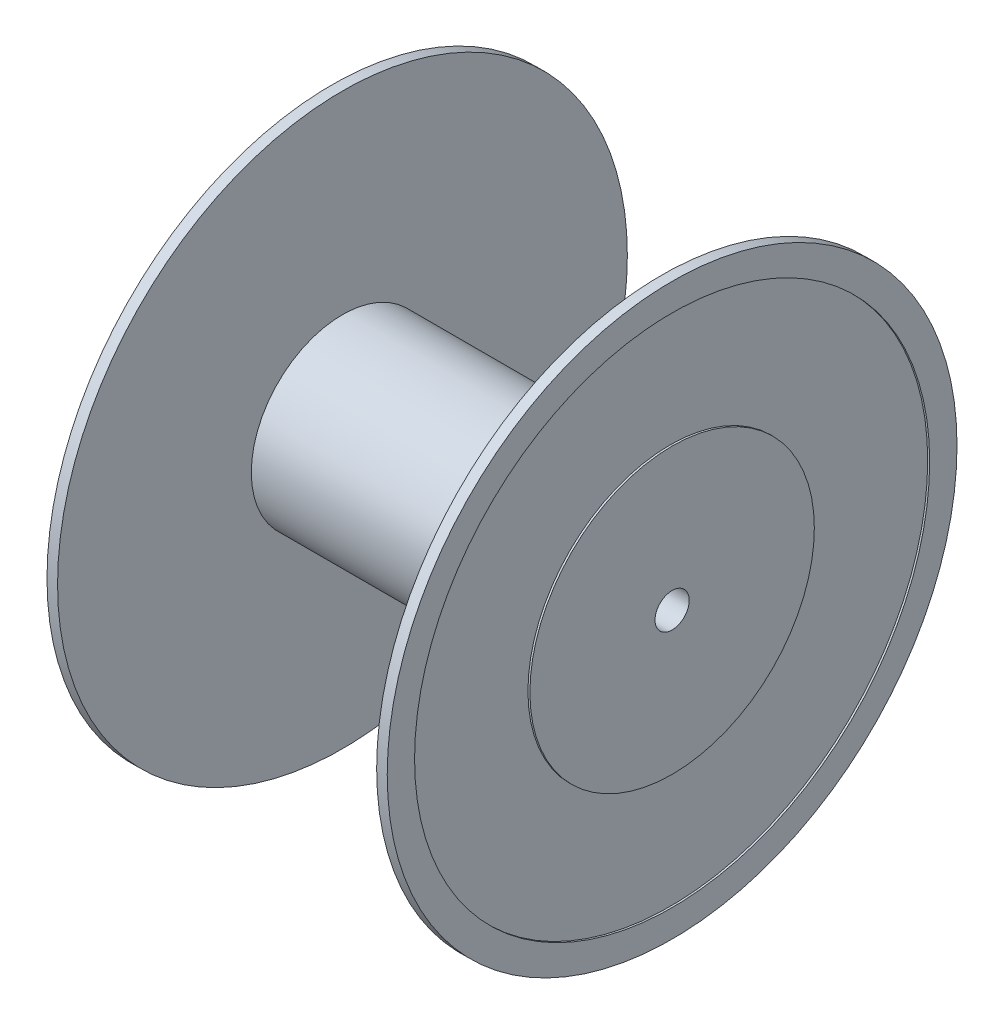
ISO-10303-21;
HEADER;
FILE_DESCRIPTION(('STEP AP214'),'2;1');
FILE_NAME('part.step','',(''),(''),'','','');
FILE_SCHEMA(('AUTOMOTIVE_DESIGN { 1 0 10303 214 1 1 1 1 }'));
ENDSEC;
DATA;
#1=APPLICATION_CONTEXT('core data for automotive mechanical design processes');
#2=APPLICATION_PROTOCOL_DEFINITION('international standard','automotive_design',2000,#1);
#3=PRODUCT_CONTEXT('',#1,'mechanical');
#4=PRODUCT('Part','Part','',(#3));
#5=PRODUCT_RELATED_PRODUCT_CATEGORY('part','',(#4));
#6=PRODUCT_DEFINITION_FORMATION('','',#4);
#7=PRODUCT_DEFINITION_CONTEXT('part definition',#1,'design');
#8=PRODUCT_DEFINITION('design','',#6,#7);
#9=PRODUCT_DEFINITION_SHAPE('','',#8);
#10=(LENGTH_UNIT() NAMED_UNIT(*) SI_UNIT(.MILLI.,.METRE.));
#11=(NAMED_UNIT(*) PLANE_ANGLE_UNIT() SI_UNIT($,.RADIAN.));
#12=(NAMED_UNIT(*) SI_UNIT($,.STERADIAN.) SOLID_ANGLE_UNIT());
#13=UNCERTAINTY_MEASURE_WITH_UNIT(LENGTH_MEASURE(1.E-05),#10,'distance_accuracy_value','');
#14=(GEOMETRIC_REPRESENTATION_CONTEXT(3) GLOBAL_UNCERTAINTY_ASSIGNED_CONTEXT((#13)) GLOBAL_UNIT_ASSIGNED_CONTEXT((#10,
#11,#12)) REPRESENTATION_CONTEXT('',''));
#15=CARTESIAN_POINT('',(0.,0.,0.));
#16=DIRECTION('',(0.,0.,1.));
#17=DIRECTION('',(1.,0.,0.));
#18=AXIS2_PLACEMENT_3D('',#15,#16,#17);
#19=CARTESIAN_POINT('',(-47.3964,0.,0.));
#20=DIRECTION('',(-1.,0.,0.));
#21=DIRECTION('',(0.,0.,-1.));
#22=AXIS2_PLACEMENT_3D('',#19,#20,#21);
#23=PLANE('',#22);
#24=CARTESIAN_POINT('',(-47.3964,0.,0.));
#25=DIRECTION('',(1.,0.,0.));
#26=DIRECTION('',(0.,0.,-1.));
#27=AXIS2_PLACEMENT_3D('',#24,#25,#26);
#28=CIRCLE('',#27,39.624);
#29=CARTESIAN_POINT('',(-47.3964,0.,-39.624));
#30=VERTEX_POINT('',#29);
#31=EDGE_CURVE('E78',#30,#30,#28,.T.);
#32=ORIENTED_EDGE('',*,*,#31,.F.);
#33=EDGE_LOOP('',(#32));
#34=FACE_BOUND('',#33,.T.);
#35=CARTESIAN_POINT('',(-47.3964,0.,0.));
#36=DIRECTION('',(1.,0.,0.));
#37=DIRECTION('',(0.,0.,-1.));
#38=AXIS2_PLACEMENT_3D('',#35,#36,#37);
#39=CIRCLE('',#38,4.7625);
#40=CARTESIAN_POINT('',(-47.3964,0.,-4.7625));
#41=VERTEX_POINT('',#40);
#42=EDGE_CURVE('E83',#41,#41,#39,.T.);
#43=ORIENTED_EDGE('',*,*,#42,.T.);
#44=EDGE_LOOP('',(#43));
#45=FACE_BOUND('',#44,.T.);
#46=ADVANCED_FACE('F30',(#34,#45),#23,.T.);
#47=CARTESIAN_POINT('',(46.8503,0.,0.));
#48=DIRECTION('',(1.,0.,0.));
#49=DIRECTION('',(0.,0.,-1.));
#50=AXIS2_PLACEMENT_3D('',#47,#48,#49);
#51=PLANE('',#50);
#52=CARTESIAN_POINT('',(46.8503,0.,0.));
#53=DIRECTION('',(1.,0.,0.));
#54=DIRECTION('',(0.,0.,-1.));
#55=AXIS2_PLACEMENT_3D('',#52,#53,#54);
#56=CIRCLE('',#55,71.755);
#57=CARTESIAN_POINT('',(46.8503,0.,-71.755));
#58=VERTEX_POINT('',#57);
#59=EDGE_CURVE('E37',#58,#58,#56,.F.);
#60=ORIENTED_EDGE('',*,*,#59,.F.);
#61=EDGE_LOOP('',(#60));
#62=FACE_BOUND('',#61,.T.);
#63=CARTESIAN_POINT('',(46.8503,0.,0.));
#64=DIRECTION('',(1.,0.,0.));
#65=DIRECTION('',(0.,0.,-1.));
#66=AXIS2_PLACEMENT_3D('',#63,#64,#65);
#67=CIRCLE('',#66,39.624);
#68=CARTESIAN_POINT('',(46.8503,0.,-39.624));
#69=VERTEX_POINT('',#68);
#70=EDGE_CURVE('E57',#69,#69,#67,.T.);
#71=ORIENTED_EDGE('',*,*,#70,.F.);
#72=EDGE_LOOP('',(#71));
#73=FACE_BOUND('',#72,.T.);
#74=ADVANCED_FACE('F106',(#62,#73),#51,.T.);
#75=CARTESIAN_POINT('',(44.45,0.,0.));
#76=DIRECTION('',(-1.,0.,0.));
#77=DIRECTION('',(0.,0.,1.));
#78=AXIS2_PLACEMENT_3D('',#75,#76,#77);
#79=CYLINDRICAL_SURFACE('',#78,25.4);
#80=CARTESIAN_POINT('',(44.45,0.,0.));
#81=DIRECTION('',(1.,0.,0.));
#82=DIRECTION('',(0.,0.,-1.));
#83=AXIS2_PLACEMENT_3D('',#80,#81,#82);
#84=CIRCLE('',#83,25.4);
#85=CARTESIAN_POINT('',(44.45,0.,-25.4));
#86=VERTEX_POINT('',#85);
#87=EDGE_CURVE('E41',#86,#86,#84,.T.);
#88=ORIENTED_EDGE('',*,*,#87,.F.);
#89=EDGE_LOOP('',(#88));
#90=FACE_BOUND('',#89,.T.);
#91=CARTESIAN_POINT('',(-44.45,0.,0.));
#92=DIRECTION('',(-1.,0.,0.));
#93=DIRECTION('',(0.,0.,1.));
#94=AXIS2_PLACEMENT_3D('',#91,#92,#93);
#95=CIRCLE('',#94,25.4);
#96=CARTESIAN_POINT('',(-44.45,0.,25.4));
#97=VERTEX_POINT('',#96);
#98=EDGE_CURVE('E65',#97,#97,#95,.T.);
#99=ORIENTED_EDGE('',*,*,#98,.F.);
#100=EDGE_LOOP('',(#99));
#101=FACE_BOUND('',#100,.T.);
#102=ADVANCED_FACE('F32',(#90,#101),#79,.T.);
#103=CARTESIAN_POINT('',(44.45,0.,0.));
#104=DIRECTION('',(1.,0.,0.));
#105=DIRECTION('',(0.,0.,-1.));
#106=AXIS2_PLACEMENT_3D('',#103,#104,#105);
#107=PLANE('',#106);
#108=CARTESIAN_POINT('',(44.45,0.,0.));
#109=DIRECTION('',(1.,0.,0.));
#110=DIRECTION('',(0.,0.,-1.));
#111=AXIS2_PLACEMENT_3D('',#108,#109,#110);
#112=CIRCLE('',#111,79.375);
#113=CARTESIAN_POINT('',(44.45,0.,-79.375));
#114=VERTEX_POINT('',#113);
#115=EDGE_CURVE('E45',#114,#114,#112,.T.);
#116=ORIENTED_EDGE('',*,*,#115,.F.);
#117=EDGE_LOOP('',(#116));
#118=FACE_BOUND('',#117,.T.);
#119=ORIENTED_EDGE('',*,*,#87,.T.);
#120=EDGE_LOOP('',(#119));
#121=FACE_BOUND('',#120,.T.);
#122=ADVANCED_FACE('F143',(#118,#121),#107,.F.);
#123=CARTESIAN_POINT('',(46.8503,0.,0.));
#124=DIRECTION('',(-1.,0.,0.));
#125=DIRECTION('',(0.,0.,1.));
#126=AXIS2_PLACEMENT_3D('',#123,#124,#125);
#127=CYLINDRICAL_SURFACE('',#126,79.375);
#128=ORIENTED_EDGE('',*,*,#115,.T.);
#129=EDGE_LOOP('',(#128));
#130=FACE_BOUND('',#129,.T.);
#131=CARTESIAN_POINT('',(47.3964,0.,0.));
#132=DIRECTION('',(1.,0.,0.));
#133=DIRECTION('',(0.,0.,-1.));
#134=AXIS2_PLACEMENT_3D('',#131,#132,#133);
#135=CIRCLE('',#134,79.375);
#136=CARTESIAN_POINT('',(47.3964,0.,-79.375));
#137=VERTEX_POINT('',#136);
#138=EDGE_CURVE('E50',#137,#137,#135,.T.);
#139=ORIENTED_EDGE('',*,*,#138,.F.);
#140=EDGE_LOOP('',(#139));
#141=FACE_BOUND('',#140,.T.);
#142=ADVANCED_FACE('F148',(#130,#141),#127,.T.);
#143=CARTESIAN_POINT('',(47.3964,0.,0.));
#144=DIRECTION('',(1.,0.,0.));
#145=DIRECTION('',(0.,0.,-1.));
#146=AXIS2_PLACEMENT_3D('',#143,#144,#145);
#147=PLANE('',#146);
#148=ORIENTED_EDGE('',*,*,#138,.T.);
#149=EDGE_LOOP('',(#148));
#150=FACE_BOUND('',#149,.T.);
#151=CARTESIAN_POINT('',(47.3964,0.,0.));
#152=DIRECTION('',(1.,0.,0.));
#153=DIRECTION('',(0.,0.,-1.));
#154=AXIS2_PLACEMENT_3D('',#151,#152,#153);
#155=CIRCLE('',#154,71.755);
#156=CARTESIAN_POINT('',(47.3964,0.,-71.755));
#157=VERTEX_POINT('',#156);
#158=EDGE_CURVE('E53',#157,#157,#155,.T.);
#159=ORIENTED_EDGE('',*,*,#158,.F.);
#160=EDGE_LOOP('',(#159));
#161=FACE_BOUND('',#160,.T.);
#162=ADVANCED_FACE('F156',(#150,#161),#147,.T.);
#163=CARTESIAN_POINT('',(47.3964,0.,0.));
#164=DIRECTION('',(-1.,0.,0.));
#165=DIRECTION('',(0.,0.,1.));
#166=AXIS2_PLACEMENT_3D('',#163,#164,#165);
#167=CYLINDRICAL_SURFACE('',#166,71.755);
#168=ORIENTED_EDGE('',*,*,#158,.T.);
#169=EDGE_LOOP('',(#168));
#170=FACE_BOUND('',#169,.T.);
#171=ORIENTED_EDGE('',*,*,#59,.T.);
#172=EDGE_LOOP('',(#171));
#173=FACE_BOUND('',#172,.T.);
#174=ADVANCED_FACE('F162',(#170,#173),#167,.F.);
#175=CARTESIAN_POINT('',(47.3964,0.,0.));
#176=DIRECTION('',(-1.,0.,0.));
#177=DIRECTION('',(0.,0.,1.));
#178=AXIS2_PLACEMENT_3D('',#175,#176,#177);
#179=CYLINDRICAL_SURFACE('',#178,39.624);
#180=CARTESIAN_POINT('',(47.3964,0.,0.));
#181=DIRECTION('',(1.,0.,0.));
#182=DIRECTION('',(0.,0.,-1.));
#183=AXIS2_PLACEMENT_3D('',#180,#181,#182);
#184=CIRCLE('',#183,39.624);
#185=CARTESIAN_POINT('',(47.3964,0.,-39.624));
#186=VERTEX_POINT('',#185);
#187=EDGE_CURVE('E56',#186,#186,#184,.T.);
#188=ORIENTED_EDGE('',*,*,#187,.F.);
#189=EDGE_LOOP('',(#188));
#190=FACE_BOUND('',#189,.T.);
#191=ORIENTED_EDGE('',*,*,#70,.T.);
#192=EDGE_LOOP('',(#191));
#193=FACE_BOUND('',#192,.T.);
#194=ADVANCED_FACE('F101',(#190,#193),#179,.T.);
#195=CARTESIAN_POINT('',(47.3964,0.,0.));
#196=DIRECTION('',(1.,0.,0.));
#197=DIRECTION('',(0.,0.,-1.));
#198=AXIS2_PLACEMENT_3D('',#195,#196,#197);
#199=PLANE('',#198);
#200=CARTESIAN_POINT('',(47.3964,0.,0.));
#201=DIRECTION('',(1.,0.,0.));
#202=DIRECTION('',(0.,0.,-1.));
#203=AXIS2_PLACEMENT_3D('',#200,#201,#202);
#204=CIRCLE('',#203,4.7625);
#205=CARTESIAN_POINT('',(47.3964,0.,-4.7625));
#206=VERTEX_POINT('',#205);
#207=EDGE_CURVE('E60',#206,#206,#204,.T.);
#208=ORIENTED_EDGE('',*,*,#207,.F.);
#209=EDGE_LOOP('',(#208));
#210=FACE_BOUND('',#209,.T.);
#211=ORIENTED_EDGE('',*,*,#187,.T.);
#212=EDGE_LOOP('',(#211));
#213=FACE_BOUND('',#212,.T.);
#214=ADVANCED_FACE('F91',(#210,#213),#199,.T.);
#215=CARTESIAN_POINT('',(0.,0.,0.));
#216=DIRECTION('',(1.,0.,0.));
#217=DIRECTION('',(0.,0.,-1.));
#218=AXIS2_PLACEMENT_3D('',#215,#216,#217);
#219=CYLINDRICAL_SURFACE('',#218,4.7625);
#220=ORIENTED_EDGE('',*,*,#207,.T.);
#221=EDGE_LOOP('',(#220));
#222=FACE_BOUND('',#221,.T.);
#223=ORIENTED_EDGE('',*,*,#42,.F.);
#224=EDGE_LOOP('',(#223));
#225=FACE_BOUND('',#224,.T.);
#226=ADVANCED_FACE('F88',(#222,#225),#219,.F.);
#227=CARTESIAN_POINT('',(-44.45,0.,0.));
#228=DIRECTION('',(-1.,0.,0.));
#229=DIRECTION('',(0.,0.,-1.));
#230=AXIS2_PLACEMENT_3D('',#227,#228,#229);
#231=PLANE('',#230);
#232=CARTESIAN_POINT('',(-44.45,0.,0.));
#233=DIRECTION('',(1.,0.,0.));
#234=DIRECTION('',(0.,0.,-1.));
#235=AXIS2_PLACEMENT_3D('',#232,#233,#234);
#236=CIRCLE('',#235,79.375);
#237=CARTESIAN_POINT('',(-44.45,0.,-79.375));
#238=VERTEX_POINT('',#237);
#239=EDGE_CURVE('E68',#238,#238,#236,.T.);
#240=ORIENTED_EDGE('',*,*,#239,.T.);
#241=EDGE_LOOP('',(#240));
#242=FACE_BOUND('',#241,.T.);
#243=ORIENTED_EDGE('',*,*,#98,.T.);
#244=EDGE_LOOP('',(#243));
#245=FACE_BOUND('',#244,.T.);
#246=ADVANCED_FACE('F90',(#242,#245),#231,.F.);
#247=CARTESIAN_POINT('',(-46.8503,0.,0.));
#248=DIRECTION('',(1.,0.,0.));
#249=DIRECTION('',(0.,0.,-1.));
#250=AXIS2_PLACEMENT_3D('',#247,#248,#249);
#251=CYLINDRICAL_SURFACE('',#250,79.375);
#252=ORIENTED_EDGE('',*,*,#239,.F.);
#253=EDGE_LOOP('',(#252));
#254=FACE_BOUND('',#253,.T.);
#255=CARTESIAN_POINT('',(-47.3964,0.,0.));
#256=DIRECTION('',(1.,0.,0.));
#257=DIRECTION('',(0.,0.,-1.));
#258=AXIS2_PLACEMENT_3D('',#255,#256,#257);
#259=CIRCLE('',#258,79.375);
#260=CARTESIAN_POINT('',(-47.3964,0.,-79.375));
#261=VERTEX_POINT('',#260);
#262=EDGE_CURVE('E71',#261,#261,#259,.T.);
#263=ORIENTED_EDGE('',*,*,#262,.T.);
#264=EDGE_LOOP('',(#263));
#265=FACE_BOUND('',#264,.T.);
#266=ADVANCED_FACE('F98',(#254,#265),#251,.T.);
#267=CARTESIAN_POINT('',(-47.3964,0.,0.));
#268=DIRECTION('',(-1.,0.,0.));
#269=DIRECTION('',(0.,0.,-1.));
#270=AXIS2_PLACEMENT_3D('',#267,#268,#269);
#271=PLANE('',#270);
#272=CARTESIAN_POINT('',(-47.3964,0.,0.));
#273=DIRECTION('',(1.,0.,0.));
#274=DIRECTION('',(0.,0.,-1.));
#275=AXIS2_PLACEMENT_3D('',#272,#273,#274);
#276=CIRCLE('',#275,71.755);
#277=CARTESIAN_POINT('',(-47.3964,0.,-71.755));
#278=VERTEX_POINT('',#277);
#279=EDGE_CURVE('E74',#278,#278,#276,.T.);
#280=ORIENTED_EDGE('',*,*,#279,.T.);
#281=EDGE_LOOP('',(#280));
#282=FACE_BOUND('',#281,.T.);
#283=ORIENTED_EDGE('',*,*,#262,.F.);
#284=EDGE_LOOP('',(#283));
#285=FACE_BOUND('',#284,.T.);
#286=ADVANCED_FACE('F124',(#282,#285),#271,.T.);
#287=CARTESIAN_POINT('',(-47.3964,0.,0.));
#288=DIRECTION('',(1.,0.,0.));
#289=DIRECTION('',(0.,0.,-1.));
#290=AXIS2_PLACEMENT_3D('',#287,#288,#289);
#291=CYLINDRICAL_SURFACE('',#290,71.755);
#292=ORIENTED_EDGE('',*,*,#279,.F.);
#293=EDGE_LOOP('',(#292));
#294=FACE_BOUND('',#293,.T.);
#295=CARTESIAN_POINT('',(-46.8503,0.,0.));
#296=DIRECTION('',(1.,0.,0.));
#297=DIRECTION('',(0.,0.,-1.));
#298=AXIS2_PLACEMENT_3D('',#295,#296,#297);
#299=CIRCLE('',#298,71.755);
#300=CARTESIAN_POINT('',(-46.8503,0.,-71.755));
#301=VERTEX_POINT('',#300);
#302=EDGE_CURVE('E75',#301,#301,#299,.T.);
#303=ORIENTED_EDGE('',*,*,#302,.T.);
#304=EDGE_LOOP('',(#303));
#305=FACE_BOUND('',#304,.T.);
#306=ADVANCED_FACE('F121',(#294,#305),#291,.F.);
#307=CARTESIAN_POINT('',(-46.8503,0.,0.));
#308=DIRECTION('',(-1.,0.,0.));
#309=DIRECTION('',(0.,0.,-1.));
#310=AXIS2_PLACEMENT_3D('',#307,#308,#309);
#311=PLANE('',#310);
#312=CARTESIAN_POINT('',(-46.8503,0.,0.));
#313=DIRECTION('',(-1.,0.,0.));
#314=DIRECTION('',(0.,0.,1.));
#315=AXIS2_PLACEMENT_3D('',#312,#313,#314);
#316=CIRCLE('',#315,39.624);
#317=CARTESIAN_POINT('',(-46.8503,0.,39.624));
#318=VERTEX_POINT('',#317);
#319=EDGE_CURVE('E10',#318,#318,#316,.T.);
#320=ORIENTED_EDGE('',*,*,#319,.F.);
#321=EDGE_LOOP('',(#320));
#322=FACE_BOUND('',#321,.T.);
#323=ORIENTED_EDGE('',*,*,#302,.F.);
#324=EDGE_LOOP('',(#323));
#325=FACE_BOUND('',#324,.T.);
#326=ADVANCED_FACE('F119',(#322,#325),#311,.T.);
#327=CARTESIAN_POINT('',(-47.3964,0.,0.));
#328=DIRECTION('',(1.,0.,0.));
#329=DIRECTION('',(0.,0.,-1.));
#330=AXIS2_PLACEMENT_3D('',#327,#328,#329);
#331=CYLINDRICAL_SURFACE('',#330,39.624);
#332=ORIENTED_EDGE('',*,*,#31,.T.);
#333=EDGE_LOOP('',(#332));
#334=FACE_BOUND('',#333,.T.);
#335=ORIENTED_EDGE('',*,*,#319,.T.);
#336=EDGE_LOOP('',(#335));
#337=FACE_BOUND('',#336,.T.);
#338=ADVANCED_FACE('F116',(#334,#337),#331,.T.);
#339=CLOSED_SHELL('',(#46,#74,#102,#122,#142,#162,#174,#194,#214,#226,#246,#266,#286,#306,#326,#338));
#340=MANIFOLD_SOLID_BREP('B2',#339);
#341=ADVANCED_BREP_SHAPE_REPRESENTATION('',(#18,#340),#14);
#342=SHAPE_DEFINITION_REPRESENTATION(#9,#341);
ENDSEC;
END-ISO-10303-21;
